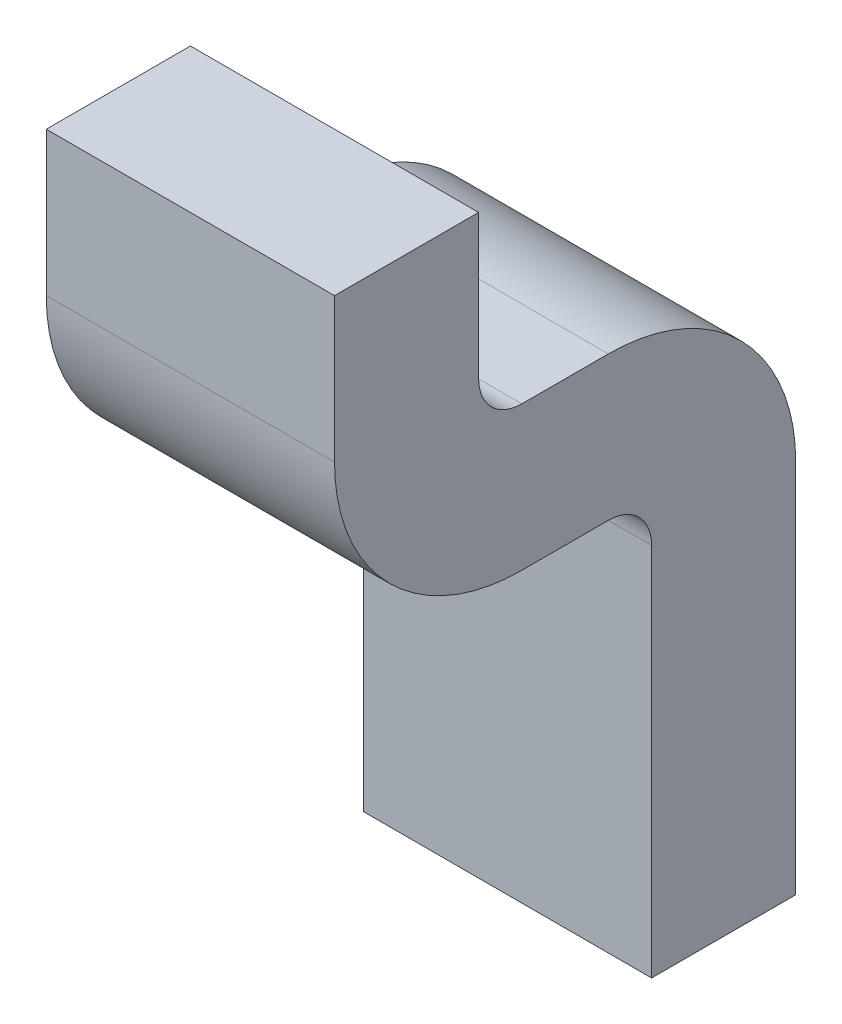
ISO-10303-21;
HEADER;
FILE_DESCRIPTION(('STEP AP214'),'2;1');
FILE_NAME('part.step','',(''),(''),'','','');
FILE_SCHEMA(('AUTOMOTIVE_DESIGN { 1 0 10303 214 1 1 1 1 }'));
ENDSEC;
DATA;
#1=APPLICATION_CONTEXT('core data for automotive mechanical design processes');
#2=APPLICATION_PROTOCOL_DEFINITION('international standard','automotive_design',2000,#1);
#3=PRODUCT_CONTEXT('',#1,'mechanical');
#4=PRODUCT('Part','Part','',(#3));
#5=PRODUCT_RELATED_PRODUCT_CATEGORY('part','',(#4));
#6=PRODUCT_DEFINITION_FORMATION('','',#4);
#7=PRODUCT_DEFINITION_CONTEXT('part definition',#1,'design');
#8=PRODUCT_DEFINITION('design','',#6,#7);
#9=PRODUCT_DEFINITION_SHAPE('','',#8);
#10=(LENGTH_UNIT() NAMED_UNIT(*) SI_UNIT(.MILLI.,.METRE.));
#11=(NAMED_UNIT(*) PLANE_ANGLE_UNIT() SI_UNIT($,.RADIAN.));
#12=(NAMED_UNIT(*) SI_UNIT($,.STERADIAN.) SOLID_ANGLE_UNIT());
#13=UNCERTAINTY_MEASURE_WITH_UNIT(LENGTH_MEASURE(1.E-05),#10,'distance_accuracy_value','');
#14=(GEOMETRIC_REPRESENTATION_CONTEXT(3) GLOBAL_UNCERTAINTY_ASSIGNED_CONTEXT((#13)) GLOBAL_UNIT_ASSIGNED_CONTEXT((#10,
#11,#12)) REPRESENTATION_CONTEXT('',''));
#15=CARTESIAN_POINT('',(0.,0.,0.));
#16=DIRECTION('',(0.,0.,1.));
#17=DIRECTION('',(1.,0.,0.));
#18=AXIS2_PLACEMENT_3D('',#15,#16,#17);
#19=CARTESIAN_POINT('',(-1.655,-3.3,-0.425));
#20=DIRECTION('',(1.,0.,0.));
#21=DIRECTION('',(0.,0.,-1.));
#22=AXIS2_PLACEMENT_3D('',#19,#20,#21);
#23=PLANE('',#22);
#24=DIRECTION('',(0.,0.,1.));
#25=VECTOR('',#24,1.);
#26=CARTESIAN_POINT('',(-1.655,-2.575,-0.225));
#27=LINE('',#26,#25);
#28=CARTESIAN_POINT('',(-1.655,-2.575,-0.225));
#29=VERTEX_POINT('',#28);
#30=CARTESIAN_POINT('',(-1.655,-2.575,-0.07499999999999));
#31=VERTEX_POINT('',#30);
#32=EDGE_CURVE('E165',#29,#31,#27,.T.);
#33=ORIENTED_EDGE('',*,*,#32,.F.);
#34=CARTESIAN_POINT('',(-1.655,-2.65,-0.225));
#35=DIRECTION('',(-1.,0.,0.));
#36=DIRECTION('',(0.,0.,1.));
#37=AXIS2_PLACEMENT_3D('',#34,#35,#36);
#38=CIRCLE('',#37,0.07499999999999);
#39=CARTESIAN_POINT('',(-1.655,-2.65,-0.299999999999995));
#40=VERTEX_POINT('',#39);
#41=EDGE_CURVE('E20',#29,#40,#38,.T.);
#42=ORIENTED_EDGE('',*,*,#41,.T.);
#43=DIRECTION('',(0.,1.,0.));
#44=VECTOR('',#43,1.);
#45=CARTESIAN_POINT('',(-1.655,-3.3,-0.3));
#46=LINE('',#45,#44);
#47=CARTESIAN_POINT('',(-1.655,-3.3,-0.3));
#48=VERTEX_POINT('',#47);
#49=EDGE_CURVE('E94',#48,#40,#46,.T.);
#50=ORIENTED_EDGE('',*,*,#49,.F.);
#51=DIRECTION('',(0.,0.,1.));
#52=VECTOR('',#51,1.);
#53=CARTESIAN_POINT('',(-1.655,-3.3,-0.425));
#54=LINE('',#53,#52);
#55=CARTESIAN_POINT('',(-1.655,-3.3,-0.55));
#56=VERTEX_POINT('',#55);
#57=EDGE_CURVE('E101',#48,#56,#54,.F.);
#58=ORIENTED_EDGE('',*,*,#57,.T.);
#59=DIRECTION('',(0.,1.,0.));
#60=VECTOR('',#59,1.);
#61=CARTESIAN_POINT('',(-1.655,-3.3,-0.55));
#62=LINE('',#61,#60);
#63=CARTESIAN_POINT('',(-1.655,-2.65,-0.55));
#64=VERTEX_POINT('',#63);
#65=EDGE_CURVE('E137',#64,#56,#62,.F.);
#66=ORIENTED_EDGE('',*,*,#65,.F.);
#67=CARTESIAN_POINT('',(-1.655,-2.65,-0.225));
#68=DIRECTION('',(-1.,0.,0.));
#69=DIRECTION('',(0.,0.,1.));
#70=AXIS2_PLACEMENT_3D('',#67,#68,#69);
#71=CIRCLE('',#70,0.325);
#72=CARTESIAN_POINT('',(-1.655,-2.325,-0.225));
#73=VERTEX_POINT('',#72);
#74=EDGE_CURVE('E129',#73,#64,#71,.T.);
#75=ORIENTED_EDGE('',*,*,#74,.F.);
#76=DIRECTION('',(0.,0.,1.));
#77=VECTOR('',#76,1.);
#78=CARTESIAN_POINT('',(-1.655,-2.325,-0.225));
#79=LINE('',#78,#77);
#80=CARTESIAN_POINT('',(-1.655,-2.325,-0.07499999999999));
#81=VERTEX_POINT('',#80);
#82=EDGE_CURVE('E140',#81,#73,#79,.F.);
#83=ORIENTED_EDGE('',*,*,#82,.F.);
#84=CARTESIAN_POINT('',(-1.655,-2.25,-0.07499999999999));
#85=DIRECTION('',(1.,0.,0.));
#86=DIRECTION('',(0.,0.,-1.));
#87=AXIS2_PLACEMENT_3D('',#84,#85,#86);
#88=CIRCLE('',#87,0.07500000000001);
#89=CARTESIAN_POINT('',(-1.655,-2.25,0.));
#90=VERTEX_POINT('',#89);
#91=EDGE_CURVE('E187',#81,#90,#88,.F.);
#92=ORIENTED_EDGE('',*,*,#91,.T.);
#93=DIRECTION('',(0.,1.,0.));
#94=VECTOR('',#93,1.);
#95=CARTESIAN_POINT('',(-1.655,-2.25,0.));
#96=LINE('',#95,#94);
#97=CARTESIAN_POINT('',(-1.655,-2.,0.));
#98=VERTEX_POINT('',#97);
#99=EDGE_CURVE('E147',#98,#90,#96,.F.);
#100=ORIENTED_EDGE('',*,*,#99,.F.);
#101=DIRECTION('',(0.,0.,1.));
#102=VECTOR('',#101,1.);
#103=CARTESIAN_POINT('',(-1.655,-2.,0.125));
#104=LINE('',#103,#102);
#105=CARTESIAN_POINT('',(-1.655,-2.,0.25));
#106=VERTEX_POINT('',#105);
#107=EDGE_CURVE('E153',#106,#98,#104,.F.);
#108=ORIENTED_EDGE('',*,*,#107,.F.);
#109=DIRECTION('',(0.,1.,0.));
#110=VECTOR('',#109,1.);
#111=CARTESIAN_POINT('',(-1.655,-2.25,0.25));
#112=LINE('',#111,#110);
#113=CARTESIAN_POINT('',(-1.655,-2.25,0.25));
#114=VERTEX_POINT('',#113);
#115=EDGE_CURVE('E159',#114,#106,#112,.T.);
#116=ORIENTED_EDGE('',*,*,#115,.F.);
#117=CARTESIAN_POINT('',(-1.655,-2.25,-0.07499999999999));
#118=DIRECTION('',(1.,0.,0.));
#119=DIRECTION('',(0.,0.,-1.));
#120=AXIS2_PLACEMENT_3D('',#117,#118,#119);
#121=CIRCLE('',#120,0.325);
#122=EDGE_CURVE('E189',#31,#114,#121,.F.);
#123=ORIENTED_EDGE('',*,*,#122,.F.);
#124=EDGE_LOOP('',(#33,#42,#50,#58,#66,#75,#83,#92,#100,#108,#116,#123));
#125=FACE_BOUND('',#124,.T.);
#126=ADVANCED_FACE('F17',(#125),#23,.T.);
#127=CARTESIAN_POINT('',(-1.905,-3.3,-0.55));
#128=DIRECTION('',(0.,0.,-1.));
#129=DIRECTION('',(-1.,0.,0.));
#130=AXIS2_PLACEMENT_3D('',#127,#128,#129);
#131=PLANE('',#130);
#132=DIRECTION('',(-1.,0.,0.));
#133=VECTOR('',#132,1.);
#134=CARTESIAN_POINT('',(-1.905,-2.65,-0.55));
#135=LINE('',#134,#133);
#136=CARTESIAN_POINT('',(-2.155,-2.65,-0.55));
#137=VERTEX_POINT('',#136);
#138=EDGE_CURVE('E142',#64,#137,#135,.T.);
#139=ORIENTED_EDGE('',*,*,#138,.F.);
#140=ORIENTED_EDGE('',*,*,#65,.T.);
#141=DIRECTION('',(1.,0.,0.));
#142=VECTOR('',#141,1.);
#143=CARTESIAN_POINT('',(-1.905,-3.3,-0.55));
#144=LINE('',#143,#142);
#145=CARTESIAN_POINT('',(-2.155,-3.3,-0.55));
#146=VERTEX_POINT('',#145);
#147=EDGE_CURVE('E107',#56,#146,#144,.F.);
#148=ORIENTED_EDGE('',*,*,#147,.T.);
#149=DIRECTION('',(0.,1.,0.));
#150=VECTOR('',#149,1.);
#151=CARTESIAN_POINT('',(-2.155,-3.3,-0.55));
#152=LINE('',#151,#150);
#153=EDGE_CURVE('E127',#137,#146,#152,.F.);
#154=ORIENTED_EDGE('',*,*,#153,.F.);
#155=EDGE_LOOP('',(#139,#140,#148,#154));
#156=FACE_BOUND('',#155,.T.);
#157=ADVANCED_FACE('F265',(#156),#131,.T.);
#158=CARTESIAN_POINT('',(-1.905,-3.3,-0.425));
#159=DIRECTION('',(0.,1.,0.));
#160=DIRECTION('',(0.,0.,1.));
#161=AXIS2_PLACEMENT_3D('',#158,#159,#160);
#162=PLANE('',#161);
#163=DIRECTION('',(1.,0.,0.));
#164=VECTOR('',#163,1.);
#165=CARTESIAN_POINT('',(-1.905,-3.3,-0.3));
#166=LINE('',#165,#164);
#167=CARTESIAN_POINT('',(-2.155,-3.3,-0.3));
#168=VERTEX_POINT('',#167);
#169=EDGE_CURVE('E109',#168,#48,#166,.T.);
#170=ORIENTED_EDGE('',*,*,#169,.F.);
#171=DIRECTION('',(0.,0.,1.));
#172=VECTOR('',#171,1.);
#173=CARTESIAN_POINT('',(-2.155,-3.3,-0.425));
#174=LINE('',#173,#172);
#175=EDGE_CURVE('E113',#146,#168,#174,.T.);
#176=ORIENTED_EDGE('',*,*,#175,.F.);
#177=ORIENTED_EDGE('',*,*,#147,.F.);
#178=ORIENTED_EDGE('',*,*,#57,.F.);
#179=EDGE_LOOP('',(#170,#176,#177,#178));
#180=FACE_BOUND('',#179,.T.);
#181=ADVANCED_FACE('F111',(#180),#162,.F.);
#182=CARTESIAN_POINT('',(-1.905,-3.3,-0.3));
#183=DIRECTION('',(0.,0.,1.));
#184=DIRECTION('',(1.,0.,0.));
#185=AXIS2_PLACEMENT_3D('',#182,#183,#184);
#186=PLANE('',#185);
#187=DIRECTION('',(-1.,0.,0.));
#188=VECTOR('',#187,1.);
#189=CARTESIAN_POINT('',(-1.905,-2.65,-0.29999999999999));
#190=LINE('',#189,#188);
#191=CARTESIAN_POINT('',(-2.155,-2.65,-0.299999999999995));
#192=VERTEX_POINT('',#191);
#193=EDGE_CURVE('E119',#40,#192,#190,.T.);
#194=ORIENTED_EDGE('',*,*,#193,.T.);
#195=DIRECTION('',(0.,1.,0.));
#196=VECTOR('',#195,1.);
#197=CARTESIAN_POINT('',(-2.155,-3.3,-0.3));
#198=LINE('',#197,#196);
#199=EDGE_CURVE('E117',#168,#192,#198,.T.);
#200=ORIENTED_EDGE('',*,*,#199,.F.);
#201=ORIENTED_EDGE('',*,*,#169,.T.);
#202=ORIENTED_EDGE('',*,*,#49,.T.);
#203=EDGE_LOOP('',(#194,#200,#201,#202));
#204=FACE_BOUND('',#203,.T.);
#205=ADVANCED_FACE('F118',(#204),#186,.T.);
#206=CARTESIAN_POINT('',(-1.905,-2.65,-0.225));
#207=DIRECTION('',(-1.,0.,0.));
#208=DIRECTION('',(0.,0.,1.));
#209=AXIS2_PLACEMENT_3D('',#206,#207,#208);
#210=CYLINDRICAL_SURFACE('',#209,0.07499999999999);
#211=DIRECTION('',(1.,0.,0.));
#212=VECTOR('',#211,1.);
#213=CARTESIAN_POINT('',(-1.905,-2.575,-0.225));
#214=LINE('',#213,#212);
#215=CARTESIAN_POINT('',(-2.155,-2.575,-0.225));
#216=VERTEX_POINT('',#215);
#217=EDGE_CURVE('E168',#216,#29,#214,.T.);
#218=ORIENTED_EDGE('',*,*,#217,.F.);
#219=CARTESIAN_POINT('',(-2.155,-2.65,-0.225));
#220=DIRECTION('',(-1.,0.,0.));
#221=DIRECTION('',(0.,0.,1.));
#222=AXIS2_PLACEMENT_3D('',#219,#220,#221);
#223=CIRCLE('',#222,0.07499999999999);
#224=EDGE_CURVE('E123',#192,#216,#223,.F.);
#225=ORIENTED_EDGE('',*,*,#224,.F.);
#226=ORIENTED_EDGE('',*,*,#193,.F.);
#227=ORIENTED_EDGE('',*,*,#41,.F.);
#228=EDGE_LOOP('',(#218,#225,#226,#227));
#229=FACE_BOUND('',#228,.T.);
#230=ADVANCED_FACE('F203',(#229),#210,.F.);
#231=CARTESIAN_POINT('',(-1.905,-2.575,-0.225));
#232=DIRECTION('',(0.,-1.,0.));
#233=DIRECTION('',(1.,0.,0.));
#234=AXIS2_PLACEMENT_3D('',#231,#232,#233);
#235=PLANE('',#234);
#236=DIRECTION('',(1.,0.,0.));
#237=VECTOR('',#236,1.);
#238=CARTESIAN_POINT('',(-1.905,-2.575,-0.0749999999999899));
#239=LINE('',#238,#237);
#240=CARTESIAN_POINT('',(-2.155,-2.575,-0.07499999999999));
#241=VERTEX_POINT('',#240);
#242=EDGE_CURVE('E167',#241,#31,#239,.T.);
#243=ORIENTED_EDGE('',*,*,#242,.F.);
#244=DIRECTION('',(0.,0.,1.));
#245=VECTOR('',#244,1.);
#246=CARTESIAN_POINT('',(-2.155,-2.575,-0.425));
#247=LINE('',#246,#245);
#248=EDGE_CURVE('E183',#216,#241,#247,.T.);
#249=ORIENTED_EDGE('',*,*,#248,.F.);
#250=ORIENTED_EDGE('',*,*,#217,.T.);
#251=ORIENTED_EDGE('',*,*,#32,.T.);
#252=EDGE_LOOP('',(#243,#249,#250,#251));
#253=FACE_BOUND('',#252,.T.);
#254=ADVANCED_FACE('F293',(#253),#235,.T.);
#255=CARTESIAN_POINT('',(-1.905,-2.25,-0.07499999999999));
#256=DIRECTION('',(1.,0.,0.));
#257=DIRECTION('',(0.,0.,-1.));
#258=AXIS2_PLACEMENT_3D('',#255,#256,#257);
#259=CYLINDRICAL_SURFACE('',#258,0.325);
#260=ORIENTED_EDGE('',*,*,#242,.T.);
#261=ORIENTED_EDGE('',*,*,#122,.T.);
#262=DIRECTION('',(1.,0.,0.));
#263=VECTOR('',#262,1.);
#264=CARTESIAN_POINT('',(-1.905,-2.25,0.25));
#265=LINE('',#264,#263);
#266=CARTESIAN_POINT('',(-2.155,-2.25,0.25));
#267=VERTEX_POINT('',#266);
#268=EDGE_CURVE('E162',#267,#114,#265,.T.);
#269=ORIENTED_EDGE('',*,*,#268,.F.);
#270=CARTESIAN_POINT('',(-2.155,-2.25,-0.07499999999999));
#271=DIRECTION('',(1.,0.,0.));
#272=DIRECTION('',(0.,0.,-1.));
#273=AXIS2_PLACEMENT_3D('',#270,#271,#272);
#274=CIRCLE('',#273,0.325);
#275=EDGE_CURVE('E179',#241,#267,#274,.F.);
#276=ORIENTED_EDGE('',*,*,#275,.F.);
#277=EDGE_LOOP('',(#260,#261,#269,#276));
#278=FACE_BOUND('',#277,.T.);
#279=ADVANCED_FACE('F290',(#278),#259,.T.);
#280=CARTESIAN_POINT('',(-1.905,-2.25,0.25));
#281=DIRECTION('',(0.,0.,1.));
#282=DIRECTION('',(1.,0.,0.));
#283=AXIS2_PLACEMENT_3D('',#280,#281,#282);
#284=PLANE('',#283);
#285=DIRECTION('',(1.,0.,0.));
#286=VECTOR('',#285,1.);
#287=CARTESIAN_POINT('',(-1.905,-2.,0.25));
#288=LINE('',#287,#286);
#289=CARTESIAN_POINT('',(-2.155,-2.,0.25));
#290=VERTEX_POINT('',#289);
#291=EDGE_CURVE('E156',#290,#106,#288,.T.);
#292=ORIENTED_EDGE('',*,*,#291,.F.);
#293=DIRECTION('',(0.,1.,0.));
#294=VECTOR('',#293,1.);
#295=CARTESIAN_POINT('',(-2.155,-3.3,0.25));
#296=LINE('',#295,#294);
#297=EDGE_CURVE('E182',#267,#290,#296,.T.);
#298=ORIENTED_EDGE('',*,*,#297,.F.);
#299=ORIENTED_EDGE('',*,*,#268,.T.);
#300=ORIENTED_EDGE('',*,*,#115,.T.);
#301=EDGE_LOOP('',(#292,#298,#299,#300));
#302=FACE_BOUND('',#301,.T.);
#303=ADVANCED_FACE('F243',(#302),#284,.T.);
#304=CARTESIAN_POINT('',(-1.905,-2.,0.125));
#305=DIRECTION('',(0.,1.,0.));
#306=DIRECTION('',(0.,0.,1.));
#307=AXIS2_PLACEMENT_3D('',#304,#305,#306);
#308=PLANE('',#307);
#309=ORIENTED_EDGE('',*,*,#107,.T.);
#310=DIRECTION('',(-1.,0.,0.));
#311=VECTOR('',#310,1.);
#312=CARTESIAN_POINT('',(-1.905,-2.,0.));
#313=LINE('',#312,#311);
#314=CARTESIAN_POINT('',(-2.155,-2.,0.));
#315=VERTEX_POINT('',#314);
#316=EDGE_CURVE('E150',#315,#98,#313,.F.);
#317=ORIENTED_EDGE('',*,*,#316,.F.);
#318=DIRECTION('',(0.,0.,1.));
#319=VECTOR('',#318,1.);
#320=CARTESIAN_POINT('',(-2.155,-2.,-0.425));
#321=LINE('',#320,#319);
#322=EDGE_CURVE('E227',#290,#315,#321,.F.);
#323=ORIENTED_EDGE('',*,*,#322,.F.);
#324=ORIENTED_EDGE('',*,*,#291,.T.);
#325=EDGE_LOOP('',(#309,#317,#323,#324));
#326=FACE_BOUND('',#325,.T.);
#327=ADVANCED_FACE('F237',(#326),#308,.T.);
#328=CARTESIAN_POINT('',(-1.905,-2.25,0.));
#329=DIRECTION('',(0.,0.,-1.));
#330=DIRECTION('',(-1.,0.,0.));
#331=AXIS2_PLACEMENT_3D('',#328,#329,#330);
#332=PLANE('',#331);
#333=ORIENTED_EDGE('',*,*,#316,.T.);
#334=ORIENTED_EDGE('',*,*,#99,.T.);
#335=DIRECTION('',(1.,0.,0.));
#336=VECTOR('',#335,1.);
#337=CARTESIAN_POINT('',(-1.905,-2.25,0.));
#338=LINE('',#337,#336);
#339=CARTESIAN_POINT('',(-2.155,-2.25,0.));
#340=VERTEX_POINT('',#339);
#341=EDGE_CURVE('E149',#90,#340,#338,.F.);
#342=ORIENTED_EDGE('',*,*,#341,.T.);
#343=DIRECTION('',(0.,1.,0.));
#344=VECTOR('',#343,1.);
#345=CARTESIAN_POINT('',(-2.155,-3.3,0.));
#346=LINE('',#345,#344);
#347=EDGE_CURVE('E178',#315,#340,#346,.F.);
#348=ORIENTED_EDGE('',*,*,#347,.F.);
#349=EDGE_LOOP('',(#333,#334,#342,#348));
#350=FACE_BOUND('',#349,.T.);
#351=ADVANCED_FACE('F250',(#350),#332,.T.);
#352=CARTESIAN_POINT('',(-1.905,-2.25,-0.07499999999999));
#353=DIRECTION('',(1.,0.,0.));
#354=DIRECTION('',(0.,0.,-1.));
#355=AXIS2_PLACEMENT_3D('',#352,#353,#354);
#356=CYLINDRICAL_SURFACE('',#355,0.07500000000001);
#357=DIRECTION('',(-1.,0.,0.));
#358=VECTOR('',#357,1.);
#359=CARTESIAN_POINT('',(-1.905,-2.325,-0.07499999999999));
#360=LINE('',#359,#358);
#361=CARTESIAN_POINT('',(-2.155,-2.325,-0.07499999999999));
#362=VERTEX_POINT('',#361);
#363=EDGE_CURVE('E143',#362,#81,#360,.F.);
#364=ORIENTED_EDGE('',*,*,#363,.F.);
#365=CARTESIAN_POINT('',(-2.155,-2.25,-0.07499999999999));
#366=DIRECTION('',(1.,0.,0.));
#367=DIRECTION('',(0.,0.,-1.));
#368=AXIS2_PLACEMENT_3D('',#365,#366,#367);
#369=CIRCLE('',#368,0.07500000000001);
#370=EDGE_CURVE('E175',#340,#362,#369,.T.);
#371=ORIENTED_EDGE('',*,*,#370,.F.);
#372=ORIENTED_EDGE('',*,*,#341,.F.);
#373=ORIENTED_EDGE('',*,*,#91,.F.);
#374=EDGE_LOOP('',(#364,#371,#372,#373));
#375=FACE_BOUND('',#374,.T.);
#376=ADVANCED_FACE('F261',(#375),#356,.F.);
#377=CARTESIAN_POINT('',(-1.905,-2.325,-0.225));
#378=DIRECTION('',(0.,1.,0.));
#379=DIRECTION('',(-1.,0.,0.));
#380=AXIS2_PLACEMENT_3D('',#377,#378,#379);
#381=PLANE('',#380);
#382=ORIENTED_EDGE('',*,*,#363,.T.);
#383=ORIENTED_EDGE('',*,*,#82,.T.);
#384=DIRECTION('',(-1.,0.,0.));
#385=VECTOR('',#384,1.);
#386=CARTESIAN_POINT('',(-1.905,-2.325,-0.225));
#387=LINE('',#386,#385);
#388=CARTESIAN_POINT('',(-2.155,-2.325,-0.225));
#389=VERTEX_POINT('',#388);
#390=EDGE_CURVE('E35',#389,#73,#387,.F.);
#391=ORIENTED_EDGE('',*,*,#390,.F.);
#392=DIRECTION('',(0.,0.,1.));
#393=VECTOR('',#392,1.);
#394=CARTESIAN_POINT('',(-2.155,-2.325,-0.425));
#395=LINE('',#394,#393);
#396=EDGE_CURVE('E26',#362,#389,#395,.F.);
#397=ORIENTED_EDGE('',*,*,#396,.F.);
#398=EDGE_LOOP('',(#382,#383,#391,#397));
#399=FACE_BOUND('',#398,.T.);
#400=ADVANCED_FACE('F257',(#399),#381,.T.);
#401=CARTESIAN_POINT('',(-1.905,-2.65,-0.225));
#402=DIRECTION('',(-1.,0.,0.));
#403=DIRECTION('',(0.,0.,1.));
#404=AXIS2_PLACEMENT_3D('',#401,#402,#403);
#405=CYLINDRICAL_SURFACE('',#404,0.325);
#406=ORIENTED_EDGE('',*,*,#390,.T.);
#407=ORIENTED_EDGE('',*,*,#74,.T.);
#408=ORIENTED_EDGE('',*,*,#138,.T.);
#409=CARTESIAN_POINT('',(-2.155,-2.65,-0.225));
#410=DIRECTION('',(-1.,0.,0.));
#411=DIRECTION('',(0.,0.,1.));
#412=AXIS2_PLACEMENT_3D('',#409,#410,#411);
#413=CIRCLE('',#412,0.325);
#414=EDGE_CURVE('E11',#389,#137,#413,.T.);
#415=ORIENTED_EDGE('',*,*,#414,.F.);
#416=EDGE_LOOP('',(#406,#407,#408,#415));
#417=FACE_BOUND('',#416,.T.);
#418=ADVANCED_FACE('F264',(#417),#405,.T.);
#419=CARTESIAN_POINT('',(-2.155,-3.3,-0.425));
#420=DIRECTION('',(-1.,0.,0.));
#421=DIRECTION('',(0.,0.,1.));
#422=AXIS2_PLACEMENT_3D('',#419,#420,#421);
#423=PLANE('',#422);
#424=ORIENTED_EDGE('',*,*,#396,.T.);
#425=ORIENTED_EDGE('',*,*,#414,.T.);
#426=ORIENTED_EDGE('',*,*,#153,.T.);
#427=ORIENTED_EDGE('',*,*,#175,.T.);
#428=ORIENTED_EDGE('',*,*,#199,.T.);
#429=ORIENTED_EDGE('',*,*,#224,.T.);
#430=ORIENTED_EDGE('',*,*,#248,.T.);
#431=ORIENTED_EDGE('',*,*,#275,.T.);
#432=ORIENTED_EDGE('',*,*,#297,.T.);
#433=ORIENTED_EDGE('',*,*,#322,.T.);
#434=ORIENTED_EDGE('',*,*,#347,.T.);
#435=ORIENTED_EDGE('',*,*,#370,.T.);
#436=EDGE_LOOP('',(#424,#425,#426,#427,#428,#429,#430,#431,#432,#433,#434,#435));
#437=FACE_BOUND('',#436,.T.);
#438=ADVANCED_FACE('F126',(#437),#423,.T.);
#439=CLOSED_SHELL('',(#126,#157,#181,#205,#230,#254,#279,#303,#327,#351,#376,#400,#418,#438));
#440=MANIFOLD_SOLID_BREP('B1',#439);
#441=ADVANCED_BREP_SHAPE_REPRESENTATION('',(#18,#440),#14);
#442=SHAPE_DEFINITION_REPRESENTATION(#9,#441);
ENDSEC;
END-ISO-10303-21;
